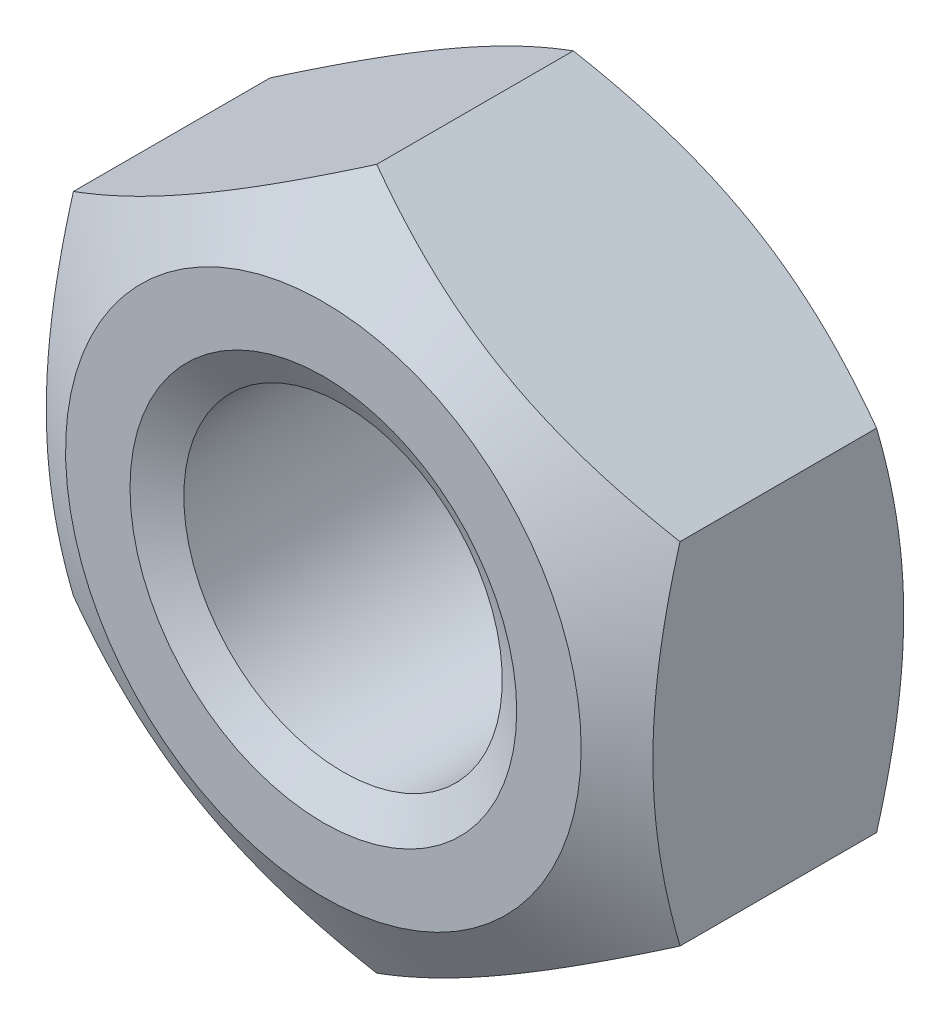
ISO-10303-21;
HEADER;
FILE_DESCRIPTION(('STEP AP214'),'2;1');
FILE_NAME('part.step','',(''),(''),'','','');
FILE_SCHEMA(('AUTOMOTIVE_DESIGN { 1 0 10303 214 1 1 1 1 }'));
ENDSEC;
DATA;
#1=APPLICATION_CONTEXT('core data for automotive mechanical design processes');
#2=APPLICATION_PROTOCOL_DEFINITION('international standard','automotive_design',2000,#1);
#3=PRODUCT_CONTEXT('',#1,'mechanical');
#4=PRODUCT('Part','Part','',(#3));
#5=PRODUCT_RELATED_PRODUCT_CATEGORY('part','',(#4));
#6=PRODUCT_DEFINITION_FORMATION('','',#4);
#7=PRODUCT_DEFINITION_CONTEXT('part definition',#1,'design');
#8=PRODUCT_DEFINITION('design','',#6,#7);
#9=PRODUCT_DEFINITION_SHAPE('','',#8);
#10=(LENGTH_UNIT() NAMED_UNIT(*) SI_UNIT(.MILLI.,.METRE.));
#11=(NAMED_UNIT(*) PLANE_ANGLE_UNIT() SI_UNIT($,.RADIAN.));
#12=(NAMED_UNIT(*) SI_UNIT($,.STERADIAN.) SOLID_ANGLE_UNIT());
#13=UNCERTAINTY_MEASURE_WITH_UNIT(LENGTH_MEASURE(1.E-05),#10,'distance_accuracy_value','');
#14=(GEOMETRIC_REPRESENTATION_CONTEXT(3) GLOBAL_UNCERTAINTY_ASSIGNED_CONTEXT((#13)) GLOBAL_UNIT_ASSIGNED_CONTEXT((#10,
#11,#12)) REPRESENTATION_CONTEXT('',''));
#15=CARTESIAN_POINT('',(0.,0.,0.));
#16=DIRECTION('',(0.,0.,1.));
#17=DIRECTION('',(1.,0.,0.));
#18=AXIS2_PLACEMENT_3D('',#15,#16,#17);
#19=CARTESIAN_POINT('',(0.,0.,0.));
#20=DIRECTION('',(0.,0.,1.));
#21=DIRECTION('',(1.,0.,0.));
#22=AXIS2_PLACEMENT_3D('',#19,#20,#21);
#23=PLANE('',#22);
#24=CARTESIAN_POINT('',(0.,0.,0.));
#25=DIRECTION('',(0.,0.,1.));
#26=DIRECTION('',(0.,-1.,0.));
#27=AXIS2_PLACEMENT_3D('',#24,#25,#26);
#28=CIRCLE('',#27,2.55);
#29=CARTESIAN_POINT('',(0.,-2.55,0.));
#30=VERTEX_POINT('',#29);
#31=EDGE_CURVE('E264',#30,#30,#28,.T.);
#32=ORIENTED_EDGE('',*,*,#31,.F.);
#33=EDGE_LOOP('',(#32));
#34=FACE_BOUND('',#33,.T.);
#35=CARTESIAN_POINT('',(0.,0.,0.));
#36=DIRECTION('',(0.,0.,1.));
#37=DIRECTION('',(1.,0.,0.));
#38=AXIS2_PLACEMENT_3D('',#35,#36,#37);
#39=CIRCLE('',#38,3.4);
#40=CARTESIAN_POINT('',(3.4,0.,0.));
#41=VERTEX_POINT('',#40);
#42=EDGE_CURVE('E223',#41,#41,#39,.T.);
#43=ORIENTED_EDGE('',*,*,#42,.T.);
#44=EDGE_LOOP('',(#43));
#45=FACE_BOUND('',#44,.T.);
#46=ADVANCED_FACE('F36',(#34,#45),#23,.T.);
#47=CARTESIAN_POINT('',(0.,0.,0.));
#48=DIRECTION('',(0.,0.,-1.));
#49=DIRECTION('',(-1.,0.,0.));
#50=AXIS2_PLACEMENT_3D('',#47,#48,#49);
#51=CONICAL_SURFACE('',#50,3.4,1.0471975511966);
#52=CARTESIAN_POINT('',(-4.0002,2.3092856067047,-0.703742420588541));
#53=CARTESIAN_POINT('',(-3.82442084967677,2.41077174646174,-0.645128035162058));
#54=CARTESIAN_POINT('',(-3.64712438367361,2.51313390883503,-0.591820482976039));
#55=CARTESIAN_POINT('',(-3.28946140682429,2.71963072479815,-0.49877183226018));
#56=CARTESIAN_POINT('',(-3.10908854102984,2.82376904741907,-0.459063650543482));
#57=CARTESIAN_POINT('',(-2.7505781812972,3.03075510011798,-0.397252376794057));
#58=CARTESIAN_POINT('',(-2.57249584706485,3.13357098372495,-0.374737893036667));
#59=CARTESIAN_POINT('',(-2.21549328283348,3.33968651028531,-0.347860784660361));
#60=CARTESIAN_POINT('',(-2.03657435035588,3.44298540411437,-0.343475902940722));
#61=CARTESIAN_POINT('',(-1.70225715780325,3.63600352522935,-0.35260023445375));
#62=CARTESIAN_POINT('',(-1.54680884001292,3.72575165335067,-0.363869115501773));
#63=CARTESIAN_POINT('',(-1.23692494436493,3.90466320392056,-0.399584152311971));
#64=CARTESIAN_POINT('',(-1.08249043825586,3.9938260075948,-0.42404250722531));
#65=CARTESIAN_POINT('',(-0.771967672225416,4.17310641015198,-0.485186226433064));
#66=CARTESIAN_POINT('',(-0.615918711936893,4.26320131938132,-0.522130765168637));
#67=CARTESIAN_POINT('',(-0.306148164596158,4.44204742827551,-0.605980234061797));
#68=CARTESIAN_POINT('',(-0.152422609226219,4.53080091904967,-0.652865463726509));
#69=CARTESIAN_POINT('',(0.000200000000000046,4.61891762357085,-0.703742420588535));
#70=B_SPLINE_CURVE_WITH_KNOTS('',3,(#52,#53,#54,#55,#56,#57,#58,#59,#60,#61,#62,#63,#64,#65,#66,
#67,#68,#69),.UNSPECIFIED.,.F.,.F.,(4,2,2,2,2,2,2,2,4),(0.,0.634047835695967,1.26961969224544,
1.88946157213122,2.50854226669298,3.04757825393386,3.58711366126903,4.13861653143762,
4.68903648037741),.UNSPECIFIED.);
#71=CARTESIAN_POINT('',(-4.,2.30940107675854,-0.703675751421939));
#72=VERTEX_POINT('',#71);
#73=CARTESIAN_POINT('',(0.,4.61880215351701,-0.703675751421931));
#74=VERTEX_POINT('',#73);
#75=EDGE_CURVE('E218',#72,#74,#70,.T.);
#76=ORIENTED_EDGE('',*,*,#75,.F.);
#77=CARTESIAN_POINT('',(-4.00000000000002,-6.07695515497812,-2.2373814474399));
#78=CARTESIAN_POINT('',(-4.00000000000002,-5.9032543263177,-2.15363732486129));
#79=CARTESIAN_POINT('',(-4.00000000000002,-5.72914085525298,-2.07073370051795));
#80=CARTESIAN_POINT('',(-4.00000000000002,-5.37986864009131,-1.90708296305103));
#81=CARTESIAN_POINT('',(-4.00000000000002,-5.20470972407353,-1.82633621728281));
#82=CARTESIAN_POINT('',(-4.00000000000002,-4.85216198559591,-1.66704105630329));
#83=CARTESIAN_POINT('',(-4.00000000000002,-4.67476611772506,-1.58850817718364));
#84=CARTESIAN_POINT('',(-4.00000000000002,-4.31851821460789,-1.43483041670244));
#85=CARTESIAN_POINT('',(-4.00000000000002,-4.13966625270327,-1.35968536593131));
#86=CARTESIAN_POINT('',(-4.00000000000002,-3.77498727863789,-1.21155595856941));
#87=CARTESIAN_POINT('',(-4.00000000000002,-3.58910865514525,-1.13869793842845));
#88=CARTESIAN_POINT('',(-4.00000000000001,-3.21513063062699,-0.998808563051088));
#89=CARTESIAN_POINT('',(-4.00000000000001,-3.02703097670914,-0.93177787874018));
#90=CARTESIAN_POINT('',(-4.00000000000001,-2.64870660136946,-0.80539597558135));
#91=CARTESIAN_POINT('',(-4.00000000000001,-2.45848751999802,-0.746028050220649));
#92=CARTESIAN_POINT('',(-4.00000000000001,-2.07532528139353,-0.636959212626413));
#93=CARTESIAN_POINT('',(-4.00000000000001,-1.88238304328725,-0.587255118544963));
#94=CARTESIAN_POINT('',(-4.00000000000001,-1.49469585021832,-0.500233591805426));
#95=CARTESIAN_POINT('',(-4.00000000000001,-1.29996491279885,-0.462854895270557));
#96=CARTESIAN_POINT('',(-4.00000000000001,-0.908220329349546,-0.402686415434137));
#97=CARTESIAN_POINT('',(-4.00000000000001,-0.711206861227053,-0.379895502801997));
#98=CARTESIAN_POINT('',(-4.,-0.31839849483112,-0.351020069763724));
#99=CARTESIAN_POINT('',(-4.,-0.122619021844374,-0.344730829827886));
#100=CARTESIAN_POINT('',(-4.,0.268775842525469,-0.348860257069983));
#101=CARTESIAN_POINT('',(-4.,0.464391227296078,-0.359279567992027));
#102=CARTESIAN_POINT('',(-4.,0.800354880614998,-0.390806759919066));
#103=CARTESIAN_POINT('',(-4.,0.941072491778448,-0.408176143924673));
#104=CARTESIAN_POINT('',(-4.,1.22138670998847,-0.450408526430881));
#105=CARTESIAN_POINT('',(-4.,1.36098314480011,-0.475272654493072));
#106=CARTESIAN_POINT('',(-4.,1.77795518732103,-0.559790316897919));
#107=CARTESIAN_POINT('',(-4.,2.0533402181718,-0.629350805422063));
#108=CARTESIAN_POINT('',(-4.,2.46499776048921,-0.748819357323082));
#109=CARTESIAN_POINT('',(-4.,2.60343041800693,-0.791698312977425));
#110=CARTESIAN_POINT('',(-3.99999999999999,2.8789496911528,-0.881620159877463));
#111=CARTESIAN_POINT('',(-3.99999999999999,3.01603629808536,-0.928663078003007));
#112=CARTESIAN_POINT('',(-3.99999999999999,3.2889129338207,-1.02618226710131));
#113=CARTESIAN_POINT('',(-3.99999999999999,3.42470343525912,-1.07665722738882));
#114=CARTESIAN_POINT('',(-3.99999999999999,3.69517894954341,-1.18047572279649));
#115=CARTESIAN_POINT('',(-3.99999999999999,3.82986397288099,-1.23381923065589));
#116=CARTESIAN_POINT('',(-3.99999999999999,4.13691488829198,-1.3586037511213));
#117=CARTESIAN_POINT('',(-3.99999999999999,4.30896022125641,-1.43083189870017));
#118=CARTESIAN_POINT('',(-3.99999999999999,4.65169566768922,-1.57844291015971));
#119=CARTESIAN_POINT('',(-3.99999999999999,4.82238571651407,-1.65382592345659));
#120=CARTESIAN_POINT('',(-3.99999999999999,5.16264905176409,-1.8071383733107));
#121=CARTESIAN_POINT('',(-3.99999999999999,5.33222215209253,-1.88506822191975));
#122=CARTESIAN_POINT('',(-3.99999999999999,5.67040669331343,-2.04299012893815));
#123=CARTESIAN_POINT('',(-3.99999999999999,5.83901811682761,-2.12298222447073));
#124=CARTESIAN_POINT('',(-3.99999999999998,6.34392630196601,-2.36561123536248));
#125=CARTESIAN_POINT('',(-3.99999999999998,6.67901057669472,-2.53077021605844));
#126=CARTESIAN_POINT('',(-3.99999999999998,7.34685912892337,-2.86571223787633));
#127=CARTESIAN_POINT('',(-3.99999999999998,7.67962333202128,-3.03549542644246));
#128=CARTESIAN_POINT('',(-3.99999999999998,8.317498765285,-3.36498995737981));
#129=CARTESIAN_POINT('',(-3.99999999999998,8.62273913527458,-3.52445174156826));
#130=CARTESIAN_POINT('',(-3.99999999999998,9.23210196710995,-3.8455148283192));
#131=CARTESIAN_POINT('',(-3.99999999999998,9.53622439670164,-4.00711619200202));
#132=CARTESIAN_POINT('',(-3.99999999999997,10.1429400100281,-4.33161439240571));
#133=CARTESIAN_POINT('',(-3.99999999999997,10.445535073287,-4.49450771938575));
#134=CARTESIAN_POINT('',(-3.99999999999997,11.0500044860671,-4.82159262428182));
#135=CARTESIAN_POINT('',(-3.99999999999997,11.3518788690681,-4.98578414029912));
#136=CARTESIAN_POINT('',(-3.99999999999997,11.6534848899343,-5.15046370914897));
#137=B_SPLINE_CURVE_WITH_KNOTS('',3,(#77,#78,#79,#80,#81,#82,#83,#84,#85,#86,#87,#88,#89,#90,
#91,#92,#93,#94,#95,#96,#97,#98,#99,#100,#101,#102,#103,#104,#105,#106,#107,#108,#109,#110,#111,
#112,#113,#114,#115,#116,#117,#118,#119,#120,#121,#122,#123,#124,#125,#126,#127,#128,#129,#130,
#131,#132,#133,#134,#135,#136),.UNSPECIFIED.,.F.,.F.,(4,2,2,2,2,2,2,2,2,2,2,2,2,2,2,2,2,2,2,2,2,
2,2,2,2,2,2,2,2,4),(0.,0.578510532643124,1.15711897581723,1.73909615938132,2.32104420861426,
2.91991150400879,3.51884765843071,4.11645511141911,4.71386546575289,5.30825996269123,
5.90260843830731,6.4895477887196,7.07650975317129,7.50165768714806,7.92686972886383,
8.77781431814756,9.2125455279647,9.64727954433008,10.0818484597445,10.516413246036,
11.0761472269744,11.6359077472955,12.195759283887,12.7556209056077,13.876288345485,
14.9969915600945,16.0301298384023,17.0632976938262,18.094255943369,19.1251653288944),.UNSPECIFIED.);
#138=CARTESIAN_POINT('',(-4.00000000000001,-2.30940107675852,-0.703675751421939));
#139=VERTEX_POINT('',#138);
#140=EDGE_CURVE('E186',#139,#72,#137,.T.);
#141=ORIENTED_EDGE('',*,*,#140,.F.);
#142=CARTESIAN_POINT('',(0.000199999999979301,-4.61891762357085,-0.703742420588535));
#143=CARTESIAN_POINT('',(-0.175579150323248,-4.51743148381381,-0.645128035162051));
#144=CARTESIAN_POINT('',(-0.352875616326401,-4.41506932144052,-0.591820482976032));
#145=CARTESIAN_POINT('',(-0.710538593175726,-4.2085725054774,-0.498771832260174));
#146=CARTESIAN_POINT('',(-0.890911458970169,-4.10443418285647,-0.459063650543475));
#147=CARTESIAN_POINT('',(-1.24942181870281,-3.89744813015756,-0.39725237679405));
#148=CARTESIAN_POINT('',(-1.42750415293516,-3.79463224655059,-0.374737893036661));
#149=CARTESIAN_POINT('',(-1.78450671716652,-3.58851671999022,-0.347860784660354));
#150=CARTESIAN_POINT('',(-1.96342564964412,-3.48521782616117,-0.343475902940715));
#151=CARTESIAN_POINT('',(-2.29774284219675,-3.29219970504618,-0.352600234453742));
#152=CARTESIAN_POINT('',(-2.45319115998708,-3.20245157692486,-0.363869115501766));
#153=CARTESIAN_POINT('',(-2.76307505563507,-3.02354002635496,-0.399584152311964));
#154=CARTESIAN_POINT('',(-2.91750956174414,-2.93437722268072,-0.424042507225304));
#155=CARTESIAN_POINT('',(-3.22803232777459,-2.75509682012353,-0.485186226433059));
#156=CARTESIAN_POINT('',(-3.38408128806311,-2.66500191089419,-0.522130765168633));
#157=CARTESIAN_POINT('',(-3.69385183540385,-2.486155802,-0.605980234061795));
#158=CARTESIAN_POINT('',(-3.84757739077379,-2.39740231122584,-0.652865463726508));
#159=CARTESIAN_POINT('',(-4.00020000000001,-2.30928560670465,-0.703742420588534));
#160=B_SPLINE_CURVE_WITH_KNOTS('',3,(#142,#143,#144,#145,#146,#147,#148,#149,#150,#151,#152,
#153,#154,#155,#156,#157,#158,#159),.UNSPECIFIED.,.F.,.F.,(4,2,2,2,2,2,2,2,4),(0.,
0.634047835695966,1.26961969224543,1.88946157213122,2.50854226669297,3.04757825393385,
3.58711366126903,4.13861653143764,4.68903648037743),.UNSPECIFIED.);
#161=CARTESIAN_POINT('',(0.,-4.61880215351702,-0.703675751421939));
#162=VERTEX_POINT('',#161);
#163=EDGE_CURVE('E178',#162,#139,#160,.T.);
#164=ORIENTED_EDGE('',*,*,#163,.F.);
#165=CARTESIAN_POINT('',(4.00019999999998,-2.30928560670469,-0.70374242058853));
#166=CARTESIAN_POINT('',(3.82442084967675,-2.41077174646173,-0.645128035162047));
#167=CARTESIAN_POINT('',(3.6471243836736,-2.51313390883502,-0.591820482976028));
#168=CARTESIAN_POINT('',(3.28946140682428,-2.71963072479813,-0.498771832260171));
#169=CARTESIAN_POINT('',(3.10908854102983,-2.82376904741906,-0.459063650543472));
#170=CARTESIAN_POINT('',(2.75057818129719,-3.03075510011797,-0.397252376794048));
#171=CARTESIAN_POINT('',(2.57249584706484,-3.13357098372493,-0.374737893036658));
#172=CARTESIAN_POINT('',(2.21549328283347,-3.3396865102853,-0.347860784660352));
#173=CARTESIAN_POINT('',(2.03657435035588,-3.44298540411435,-0.343475902940714));
#174=CARTESIAN_POINT('',(1.70225715780325,-3.63600352522933,-0.352600234453741));
#175=CARTESIAN_POINT('',(1.54680884001291,-3.72575165335066,-0.363869115501765));
#176=CARTESIAN_POINT('',(1.23692494436492,-3.90466320392055,-0.399584152311964));
#177=CARTESIAN_POINT('',(1.08249043825585,-3.99382600759479,-0.424042507225304));
#178=CARTESIAN_POINT('',(0.771967672225402,-4.17310641015198,-0.485186226433059));
#179=CARTESIAN_POINT('',(0.615918711936877,-4.26320131938132,-0.522130765168633));
#180=CARTESIAN_POINT('',(0.30614816459614,-4.44204742827551,-0.605980234061796));
#181=CARTESIAN_POINT('',(0.1524226092262,-4.53080091904967,-0.652865463726509));
#182=CARTESIAN_POINT('',(-0.000200000000020717,-4.61891762357085,-0.703742420588535));
#183=B_SPLINE_CURVE_WITH_KNOTS('',3,(#165,#166,#167,#168,#169,#170,#171,#172,#173,#174,#175,
#176,#177,#178,#179,#180,#181,#182),.UNSPECIFIED.,.F.,.F.,(4,2,2,2,2,2,2,2,4),(0.,
0.634047835695965,1.26961969224543,1.88946157213122,2.50854226669297,3.04757825393385,
3.58711366126903,4.13861653143763,4.68903648037742),.UNSPECIFIED.);
#184=CARTESIAN_POINT('',(4.00000000000002,-2.3094010767585,-0.703675751421939));
#185=VERTEX_POINT('',#184);
#186=EDGE_CURVE('E94',#185,#162,#183,.T.);
#187=ORIENTED_EDGE('',*,*,#186,.F.);
#188=CARTESIAN_POINT('',(3.99999999999997,-6.0769551549324,-2.23738144741783));
#189=CARTESIAN_POINT('',(3.99999999999997,-5.90325432627351,-2.15363732484015));
#190=CARTESIAN_POINT('',(3.99999999999997,-5.72914085521033,-2.07073370049774));
#191=CARTESIAN_POINT('',(3.99999999999997,-5.37986864005173,-1.90708296303267));
#192=CARTESIAN_POINT('',(3.99999999999998,-5.20470972403549,-1.82633621726538));
#193=CARTESIAN_POINT('',(3.99999999999998,-4.85216198556098,-1.66704105628771));
#194=CARTESIAN_POINT('',(3.99999999999998,-4.6747661176917,-1.58850817716899));
#195=CARTESIAN_POINT('',(3.99999999999998,-4.31851821457767,-1.43483041668963));
#196=CARTESIAN_POINT('',(3.99999999999998,-4.13966625267463,-1.35968536591941));
#197=CARTESIAN_POINT('',(3.99999999999998,-3.7749872786125,-1.21155595855934));
#198=CARTESIAN_POINT('',(3.99999999999998,-3.58910865512155,-1.1386979384193));
#199=CARTESIAN_POINT('',(3.99999999999998,-3.21513063060667,-0.998808563043735));
#200=CARTESIAN_POINT('',(3.99999999999998,-3.02703097669053,-0.931777878733698));
#201=CARTESIAN_POINT('',(3.99999999999998,-2.6487066013543,-0.80539597557652));
#202=CARTESIAN_POINT('',(3.99999999999998,-2.4584875199846,-0.746028050216601));
#203=CARTESIAN_POINT('',(3.99999999999998,-2.07532528138363,-0.636959212623796));
#204=CARTESIAN_POINT('',(3.99999999999998,-1.88238304327914,-0.587255118542993));
#205=CARTESIAN_POINT('',(3.99999999999999,-1.49469585021477,-0.500233591804753));
#206=CARTESIAN_POINT('',(3.99999999999999,-1.29996491279806,-0.462854895270476));
#207=CARTESIAN_POINT('',(3.99999999999999,-0.908220329354366,-0.402686415434816));
#208=CARTESIAN_POINT('',(3.99999999999999,-0.711206861234705,-0.379895502802841));
#209=CARTESIAN_POINT('',(3.99999999999999,-0.318398494844387,-0.351020069764402));
#210=CARTESIAN_POINT('',(3.99999999999999,-0.122619021860423,-0.344730829828239));
#211=CARTESIAN_POINT('',(3.99999999999999,0.268775842503905,-0.348860257069217));
#212=CARTESIAN_POINT('',(3.99999999999999,0.464391227271782,-0.359279567990468));
#213=CARTESIAN_POINT('',(3.99999999999999,0.800354880587181,-0.390806759915922));
#214=CARTESIAN_POINT('',(3.99999999999999,0.941072491749812,-0.40817614392089));
#215=CARTESIAN_POINT('',(3.99999999999999,1.22138670995823,-0.450408526425786));
#216=CARTESIAN_POINT('',(3.99999999999999,1.36098314476908,-0.475272654487303));
#217=CARTESIAN_POINT('',(3.99999999999999,1.77795518728769,-0.559790316890113));
#218=CARTESIAN_POINT('',(4.,2.05334021813697,-0.629350805412878));
#219=CARTESIAN_POINT('',(4.,2.46499776045215,-0.748819357311856));
#220=CARTESIAN_POINT('',(4.,2.60343041796912,-0.791698312965514));
#221=CARTESIAN_POINT('',(4.,2.87894969111348,-0.8816201598642));
#222=CARTESIAN_POINT('',(4.,3.01603629804529,-0.928663077989078));
#223=CARTESIAN_POINT('',(4.,3.28891293377914,-1.02618226708607));
#224=CARTESIAN_POINT('',(4.,3.42470343521681,-1.07665722737293));
#225=CARTESIAN_POINT('',(4.,3.69517894949961,-1.18047572277933));
#226=CARTESIAN_POINT('',(4.,3.82986397283645,-1.2338192306381));
#227=CARTESIAN_POINT('',(4.,4.13691488824689,-1.35860375110258));
#228=CARTESIAN_POINT('',(4.,4.30896022121151,-1.43083189868117));
#229=CARTESIAN_POINT('',(4.,4.65169566764468,-1.5784429101402));
#230=CARTESIAN_POINT('',(4.,4.82238571646969,-1.65382592343687));
#231=CARTESIAN_POINT('',(4.,5.16264905172003,-1.80713837329059));
#232=CARTESIAN_POINT('',(4.00000000000001,5.33222215204862,-1.88506822189947));
#233=CARTESIAN_POINT('',(4.00000000000001,5.67040669326981,-2.04299012891757));
#234=CARTESIAN_POINT('',(4.00000000000001,5.83901811678412,-2.12298222445002));
#235=CARTESIAN_POINT('',(4.00000000000001,6.34392630192293,-2.36561123534142));
#236=CARTESIAN_POINT('',(4.00000000000001,6.67901057665187,-2.53077021603721));
#237=CARTESIAN_POINT('',(4.00000000000001,7.34685912888098,-2.86571223785483));
#238=CARTESIAN_POINT('',(4.00000000000001,7.6796233319791,-3.03549542642086));
#239=CARTESIAN_POINT('',(4.00000000000002,8.31749876524306,-3.36498995735798));
#240=CARTESIAN_POINT('',(4.00000000000002,8.62273913523266,-3.52445174154631));
#241=CARTESIAN_POINT('',(4.00000000000002,9.23210196706807,-3.84551482829702));
#242=CARTESIAN_POINT('',(4.00000000000002,9.53622439665977,-4.00711619197974));
#243=CARTESIAN_POINT('',(4.00000000000002,10.1429400099863,-4.33161439238322));
#244=CARTESIAN_POINT('',(4.00000000000002,10.4455350732451,-4.49450771936317));
#245=CARTESIAN_POINT('',(4.00000000000002,11.0500044860252,-4.82159262425907));
#246=CARTESIAN_POINT('',(4.00000000000002,11.3518788690262,-4.98578414027629));
#247=CARTESIAN_POINT('',(4.00000000000002,11.6534848898923,-5.15046370912605));
#248=B_SPLINE_CURVE_WITH_KNOTS('',3,(#188,#189,#190,#191,#192,#193,#194,#195,#196,#197,#198,
#199,#200,#201,#202,#203,#204,#205,#206,#207,#208,#209,#210,#211,#212,#213,#214,#215,#216,#217,
#218,#219,#220,#221,#222,#223,#224,#225,#226,#227,#228,#229,#230,#231,#232,#233,#234,#235,#236,
#237,#238,#239,#240,#241,#242,#243,#244,#245,#246,#247),.UNSPECIFIED.,.F.,.F.,(4,2,2,2,2,2,2,2,
2,2,2,2,2,2,2,2,2,2,2,2,2,2,2,2,2,2,2,2,2,4),(0.,0.578510532637764,1.15711897580652,
1.73909615936518,2.3210442085927,2.91991150398152,3.51884765839774,4.11645511138047,
4.71386546570857,5.30825996263843,5.90260843824604,6.48954778865005,7.07650975309345,
7.50165768706756,7.92686972878065,8.77781431805904,9.21254552787339,9.64727954423599,
10.0818484596477,10.5164132459364,11.076147226875,11.6359077471963,12.195759283788,
12.7556209055089,13.8762883453866,14.9969915599965,16.0301298383042,17.063297693728,
18.0942559432706,19.1251653287958),.UNSPECIFIED.);
#249=CARTESIAN_POINT('',(4.,2.30940107675854,-0.703675751421939));
#250=VERTEX_POINT('',#249);
#251=EDGE_CURVE('E90',#250,#185,#248,.F.);
#252=ORIENTED_EDGE('',*,*,#251,.F.);
#253=CARTESIAN_POINT('',(-0.000200000000000122,4.61891762357085,-0.703742420588534));
#254=CARTESIAN_POINT('',(0.175579150323227,4.51743148381381,-0.645128035162051));
#255=CARTESIAN_POINT('',(0.352875616326379,4.41506932144052,-0.591820482976031));
#256=CARTESIAN_POINT('',(0.710538593175704,4.2085725054774,-0.498771832260173));
#257=CARTESIAN_POINT('',(0.890911458970149,4.10443418285647,-0.459063650543474));
#258=CARTESIAN_POINT('',(1.24942181870279,3.89744813015756,-0.397252376794049));
#259=CARTESIAN_POINT('',(1.42750415293514,3.79463224655059,-0.374737893036658));
#260=CARTESIAN_POINT('',(1.78450671716651,3.58851671999023,-0.347860784660351));
#261=CARTESIAN_POINT('',(1.9634256496441,3.48521782616117,-0.343475902940713));
#262=CARTESIAN_POINT('',(2.29774284219673,3.29219970504619,-0.352600234453739));
#263=CARTESIAN_POINT('',(2.45319115998706,3.20245157692486,-0.363869115501762));
#264=CARTESIAN_POINT('',(2.76307505563505,3.02354002635496,-0.39958415231196));
#265=CARTESIAN_POINT('',(2.91750956174413,2.93437722268072,-0.424042507225299));
#266=CARTESIAN_POINT('',(3.22803232777457,2.75509682012354,-0.485186226433055));
#267=CARTESIAN_POINT('',(3.3840812880631,2.6650019108942,-0.522130765168628));
#268=CARTESIAN_POINT('',(3.69385183540384,2.486155802,-0.60598023406179));
#269=CARTESIAN_POINT('',(3.84757739077378,2.39740231122584,-0.652865463726503));
#270=CARTESIAN_POINT('',(4.0002,2.30928560670466,-0.703742420588529));
#271=B_SPLINE_CURVE_WITH_KNOTS('',3,(#253,#254,#255,#256,#257,#258,#259,#260,#261,#262,#263,
#264,#265,#266,#267,#268,#269,#270),.UNSPECIFIED.,.F.,.F.,(4,2,2,2,2,2,2,2,4),(0.,
0.634047835695965,1.26961969224543,1.88946157213122,2.50854226669297,3.04757825393386,
3.58711366126903,4.13861653143764,4.68903648037743),.UNSPECIFIED.);
#272=EDGE_CURVE('E62',#74,#250,#271,.T.);
#273=ORIENTED_EDGE('',*,*,#272,.F.);
#274=EDGE_LOOP('',(#76,#141,#164,#187,#252,#273));
#275=FACE_BOUND('',#274,.T.);
#276=ORIENTED_EDGE('',*,*,#42,.F.);
#277=EDGE_LOOP('',(#276));
#278=FACE_BOUND('',#277,.T.);
#279=ADVANCED_FACE('F91',(#275,#278),#51,.T.);
#280=CARTESIAN_POINT('',(4.,2.3094010767585,-4.));
#281=DIRECTION('',(0.500000000000002,0.866025403784438,0.));
#282=DIRECTION('',(-0.866025403784438,0.500000000000002,0.));
#283=AXIS2_PLACEMENT_3D('',#280,#281,#282);
#284=PLANE('',#283);
#285=DIRECTION('',(0.,0.,1.));
#286=VECTOR('',#285,1.);
#287=CARTESIAN_POINT('',(4.,2.3094010767585,-4.));
#288=LINE('',#287,#286);
#289=CARTESIAN_POINT('',(4.,2.30940107675852,-3.29632424857807));
#290=VERTEX_POINT('',#289);
#291=EDGE_CURVE('E11',#290,#250,#288,.T.);
#292=ORIENTED_EDGE('',*,*,#291,.F.);
#293=CARTESIAN_POINT('',(4.0002,2.30928560670466,-3.29625757941147));
#294=CARTESIAN_POINT('',(3.82442084967677,2.4107717464617,-3.35487196483796));
#295=CARTESIAN_POINT('',(3.64712438367362,2.51313390883499,-3.40817951702398));
#296=CARTESIAN_POINT('',(3.28946140682429,2.71963072479811,-3.50122816773983));
#297=CARTESIAN_POINT('',(3.10908854102985,2.82376904741904,-3.54093634945653));
#298=CARTESIAN_POINT('',(2.75057818129721,3.03075510011795,-3.60274762320596));
#299=CARTESIAN_POINT('',(2.57249584706486,3.13357098372491,-3.62526210696335));
#300=CARTESIAN_POINT('',(2.21549328283349,3.33968651028528,-3.65213921533965));
#301=CARTESIAN_POINT('',(2.0365743503559,3.44298540411434,-3.65652409705929));
#302=CARTESIAN_POINT('',(1.70225715780327,3.63600352522932,-3.64739976554626));
#303=CARTESIAN_POINT('',(1.54680884001294,3.72575165335064,-3.63613088449824));
#304=CARTESIAN_POINT('',(1.23692494436495,3.90466320392054,-3.60041584768804));
#305=CARTESIAN_POINT('',(1.08249043825587,3.99382600759478,-3.5759574927747));
#306=CARTESIAN_POINT('',(0.771967672225423,4.17310641015197,-3.51481377356694));
#307=CARTESIAN_POINT('',(0.615918711936899,4.26320131938131,-3.47786923483137));
#308=CARTESIAN_POINT('',(0.306148164596161,4.44204742827551,-3.39401976593821));
#309=CARTESIAN_POINT('',(0.152422609226221,4.53080091904967,-3.34713453627349));
#310=CARTESIAN_POINT('',(-0.000199999999999848,4.61891762357085,-3.29625757941147));
#311=B_SPLINE_CURVE_WITH_KNOTS('',3,(#293,#294,#295,#296,#297,#298,#299,#300,#301,#302,#303,
#304,#305,#306,#307,#308,#309,#310),.UNSPECIFIED.,.F.,.F.,(4,2,2,2,2,2,2,2,4),(0.,
0.634047835695965,1.26961969224543,1.88946157213122,2.50854226669296,3.04757825393385,
3.58711366126903,4.13861653143764,4.68903648037743),.UNSPECIFIED.);
#312=CARTESIAN_POINT('',(0.,4.61880215351701,-3.29632424857807));
#313=VERTEX_POINT('',#312);
#314=EDGE_CURVE('E110',#290,#313,#311,.T.);
#315=ORIENTED_EDGE('',*,*,#314,.T.);
#316=DIRECTION('',(0.,0.,1.));
#317=VECTOR('',#316,1.);
#318=CARTESIAN_POINT('',(0.,4.61880215351701,-4.));
#319=LINE('',#318,#317);
#320=EDGE_CURVE('E41',#313,#74,#319,.T.);
#321=ORIENTED_EDGE('',*,*,#320,.T.);
#322=ORIENTED_EDGE('',*,*,#272,.T.);
#323=EDGE_LOOP('',(#292,#315,#321,#322));
#324=FACE_BOUND('',#323,.T.);
#325=ADVANCED_FACE('F38',(#324),#284,.T.);
#326=CARTESIAN_POINT('',(3.99999999999998,-2.30940107675853,-4.));
#327=DIRECTION('',(1.,0.,0.));
#328=DIRECTION('',(0.,1.,0.));
#329=AXIS2_PLACEMENT_3D('',#326,#327,#328);
#330=PLANE('',#329);
#331=DIRECTION('',(0.,0.,1.));
#332=VECTOR('',#331,1.);
#333=CARTESIAN_POINT('',(3.99999999999998,-2.30940107675853,-4.));
#334=LINE('',#333,#332);
#335=CARTESIAN_POINT('',(3.99999999999999,-2.30940107675852,-3.29632424857807));
#336=VERTEX_POINT('',#335);
#337=EDGE_CURVE('E46',#336,#185,#334,.T.);
#338=ORIENTED_EDGE('',*,*,#337,.F.);
#339=CARTESIAN_POINT('',(3.99999999999997,-6.07695515493239,-1.76261855258217));
#340=CARTESIAN_POINT('',(3.99999999999997,-5.90325432627351,-1.84636267515985));
#341=CARTESIAN_POINT('',(3.99999999999997,-5.72914085521032,-1.92926629950225));
#342=CARTESIAN_POINT('',(3.99999999999997,-5.37986864005173,-2.09291703696732));
#343=CARTESIAN_POINT('',(3.99999999999998,-5.20470972403549,-2.17366378273462));
#344=CARTESIAN_POINT('',(3.99999999999998,-4.85216198556098,-2.33295894371229));
#345=CARTESIAN_POINT('',(3.99999999999998,-4.6747661176917,-2.41149182283101));
#346=CARTESIAN_POINT('',(3.99999999999998,-4.31851821457767,-2.56516958331037));
#347=CARTESIAN_POINT('',(3.99999999999998,-4.13966625267463,-2.64031463408059));
#348=CARTESIAN_POINT('',(3.99999999999998,-3.7749872786125,-2.78844404144066));
#349=CARTESIAN_POINT('',(3.99999999999998,-3.58910865512154,-2.8613020615807));
#350=CARTESIAN_POINT('',(3.99999999999998,-3.21513063060667,-3.00119143695627));
#351=CARTESIAN_POINT('',(3.99999999999998,-3.02703097669053,-3.0682221212663));
#352=CARTESIAN_POINT('',(3.99999999999998,-2.6487066013543,-3.19460402442348));
#353=CARTESIAN_POINT('',(3.99999999999998,-2.4584875199846,-3.2539719497834));
#354=CARTESIAN_POINT('',(3.99999999999998,-2.07532528138363,-3.36304078737621));
#355=CARTESIAN_POINT('',(3.99999999999998,-1.88238304327914,-3.41274488145701));
#356=CARTESIAN_POINT('',(3.99999999999999,-1.49469585021476,-3.49976640819525));
#357=CARTESIAN_POINT('',(3.99999999999999,-1.29996491279806,-3.53714510472953));
#358=CARTESIAN_POINT('',(3.99999999999999,-0.908220329354364,-3.59731358456519));
#359=CARTESIAN_POINT('',(3.99999999999999,-0.711206861234704,-3.62010449719716));
#360=CARTESIAN_POINT('',(3.99999999999999,-0.318398494844385,-3.6489799302356));
#361=CARTESIAN_POINT('',(3.99999999999999,-0.122619021860421,-3.65526917017176));
#362=CARTESIAN_POINT('',(3.99999999999999,0.268775842503906,-3.65113974293079));
#363=CARTESIAN_POINT('',(3.99999999999999,0.464391227271783,-3.64072043200953));
#364=CARTESIAN_POINT('',(3.99999999999999,0.800354880587182,-3.60919324008408));
#365=CARTESIAN_POINT('',(3.99999999999999,0.941072491749812,-3.59182385607911));
#366=CARTESIAN_POINT('',(3.99999999999999,1.22138670995823,-3.54959147357422));
#367=CARTESIAN_POINT('',(3.99999999999999,1.36098314476908,-3.5247273455127));
#368=CARTESIAN_POINT('',(3.99999999999999,1.77795518728769,-3.44020968310989));
#369=CARTESIAN_POINT('',(4.,2.05334021813697,-3.37064919458713));
#370=CARTESIAN_POINT('',(4.,2.46499776045215,-3.25118064268815));
#371=CARTESIAN_POINT('',(4.,2.60343041796911,-3.20830168703449));
#372=CARTESIAN_POINT('',(4.,2.87894969111347,-3.1183798401358));
#373=CARTESIAN_POINT('',(4.,3.01603629804529,-3.07133692201093));
#374=CARTESIAN_POINT('',(4.,3.28891293377913,-2.97381773291393));
#375=CARTESIAN_POINT('',(4.,3.4247034352168,-2.92334277262707));
#376=CARTESIAN_POINT('',(4.,3.6951789494996,-2.81952427722068));
#377=CARTESIAN_POINT('',(4.,3.82986397283644,-2.7661807693619));
#378=CARTESIAN_POINT('',(4.,4.13691488824688,-2.64139624889742));
#379=CARTESIAN_POINT('',(4.,4.3089602212115,-2.56916810131884));
#380=CARTESIAN_POINT('',(4.,4.65169566764467,-2.4215570898598));
#381=CARTESIAN_POINT('',(4.,4.82238571646968,-2.34617407656314));
#382=CARTESIAN_POINT('',(4.,5.16264905172002,-2.19286162670942));
#383=CARTESIAN_POINT('',(4.00000000000001,5.3322221520486,-2.11493177810053));
#384=CARTESIAN_POINT('',(4.00000000000001,5.6704066932698,-1.95700987108243));
#385=CARTESIAN_POINT('',(4.00000000000001,5.83901811678411,-1.87701777554998));
#386=CARTESIAN_POINT('',(4.00000000000001,6.34392630192291,-1.63438876465858));
#387=CARTESIAN_POINT('',(4.00000000000001,6.67901057665186,-1.46922978396279));
#388=CARTESIAN_POINT('',(4.00000000000001,7.34685912888097,-1.13428776214517));
#389=CARTESIAN_POINT('',(4.00000000000001,7.67962333197908,-0.964504573579142));
#390=CARTESIAN_POINT('',(4.00000000000002,8.31749876524304,-0.635010042642018));
#391=CARTESIAN_POINT('',(4.00000000000002,8.62273913523264,-0.475548258453689));
#392=CARTESIAN_POINT('',(4.00000000000002,9.23210196706805,-0.154485171702978));
#393=CARTESIAN_POINT('',(4.00000000000002,9.53622439665975,0.00711619197974118));
#394=CARTESIAN_POINT('',(4.00000000000002,10.1429400099863,0.331614392383225));
#395=CARTESIAN_POINT('',(4.00000000000002,10.445535073245,0.494507719363168));
#396=CARTESIAN_POINT('',(4.00000000000002,11.0500044860251,0.821592624259068));
#397=CARTESIAN_POINT('',(4.00000000000002,11.3518788690261,0.985784140276285));
#398=CARTESIAN_POINT('',(4.00000000000002,11.6534848898923,1.15046370912605));
#399=B_SPLINE_CURVE_WITH_KNOTS('',3,(#339,#340,#341,#342,#343,#344,#345,#346,#347,#348,#349,
#350,#351,#352,#353,#354,#355,#356,#357,#358,#359,#360,#361,#362,#363,#364,#365,#366,#367,#368,
#369,#370,#371,#372,#373,#374,#375,#376,#377,#378,#379,#380,#381,#382,#383,#384,#385,#386,#387,
#388,#389,#390,#391,#392,#393,#394,#395,#396,#397,#398),.UNSPECIFIED.,.F.,.F.,(4,2,2,2,2,2,2,2,
2,2,2,2,2,2,2,2,2,2,2,2,2,2,2,2,2,2,2,2,2,4),(0.,0.578510532637765,1.15711897580652,
1.73909615936518,2.3210442085927,2.91991150398152,3.51884765839774,4.11645511138047,
4.71386546570857,5.30825996263843,5.90260843824604,6.48954778865005,7.07650975309345,
7.50165768706756,7.92686972878065,8.77781431805903,9.21254552787339,9.64727954423599,
10.0818484596477,10.5164132459364,11.076147226875,11.6359077471963,12.195759283788,
12.7556209055089,13.8762883453866,14.9969915599965,16.0301298383042,17.063297693728,
18.0942559432706,19.1251653287958),.UNSPECIFIED.);
#400=EDGE_CURVE('E108',#336,#290,#399,.T.);
#401=ORIENTED_EDGE('',*,*,#400,.T.);
#402=ORIENTED_EDGE('',*,*,#291,.T.);
#403=ORIENTED_EDGE('',*,*,#251,.T.);
#404=EDGE_LOOP('',(#338,#401,#402,#403));
#405=FACE_BOUND('',#404,.T.);
#406=ADVANCED_FACE('F107',(#405),#330,.T.);
#407=CARTESIAN_POINT('',(0.,-4.61880215351701,-4.));
#408=DIRECTION('',(0.499999999999997,-0.866025403784441,0.));
#409=DIRECTION('',(0.866025403784441,0.499999999999997,0.));
#410=AXIS2_PLACEMENT_3D('',#407,#408,#409);
#411=PLANE('',#410);
#412=DIRECTION('',(0.,0.,1.));
#413=VECTOR('',#412,1.);
#414=CARTESIAN_POINT('',(0.,-4.61880215351701,-4.));
#415=LINE('',#414,#413);
#416=CARTESIAN_POINT('',(0.,-4.61880215351701,-3.29632424857807));
#417=VERTEX_POINT('',#416);
#418=EDGE_CURVE('E207',#417,#162,#415,.T.);
#419=ORIENTED_EDGE('',*,*,#418,.F.);
#420=CARTESIAN_POINT('',(-0.00020000000002079,-4.61891762357085,-3.29625757941147));
#421=CARTESIAN_POINT('',(0.175579150323208,-4.51743148381381,-3.35487196483795));
#422=CARTESIAN_POINT('',(0.352875616326361,-4.41506932144052,-3.40817951702397));
#423=CARTESIAN_POINT('',(0.710538593175687,-4.2085725054774,-3.50122816773983));
#424=CARTESIAN_POINT('',(0.890911458970132,-4.10443418285647,-3.54093634945653));
#425=CARTESIAN_POINT('',(1.24942181870277,-3.89744813015757,-3.60274762320595));
#426=CARTESIAN_POINT('',(1.42750415293512,-3.7946322465506,-3.62526210696334));
#427=CARTESIAN_POINT('',(1.78450671716649,-3.58851671999024,-3.65213921533965));
#428=CARTESIAN_POINT('',(1.96342564964408,-3.48521782616118,-3.65652409705929));
#429=CARTESIAN_POINT('',(2.29774284219672,-3.2921997050462,-3.64739976554626));
#430=CARTESIAN_POINT('',(2.45319115998705,-3.20245157692488,-3.63613088449824));
#431=CARTESIAN_POINT('',(2.76307505563504,-3.02354002635498,-3.60041584768804));
#432=CARTESIAN_POINT('',(2.91750956174411,-2.93437722268074,-3.5759574927747));
#433=CARTESIAN_POINT('',(3.22803232777456,-2.75509682012356,-3.51481377356695));
#434=CARTESIAN_POINT('',(3.38408128806308,-2.66500191089422,-3.47786923483137));
#435=CARTESIAN_POINT('',(3.69385183540382,-2.48615580200003,-3.39401976593821));
#436=CARTESIAN_POINT('',(3.84757739077376,-2.39740231122587,-3.3471345362735));
#437=CARTESIAN_POINT('',(4.00019999999998,-2.30928560670469,-3.29625757941147));
#438=B_SPLINE_CURVE_WITH_KNOTS('',3,(#420,#421,#422,#423,#424,#425,#426,#427,#428,#429,#430,
#431,#432,#433,#434,#435,#436,#437),.UNSPECIFIED.,.F.,.F.,(4,2,2,2,2,2,2,2,4),(0.,
0.634047835695966,1.26961969224543,1.88946157213122,2.50854226669297,3.04757825393385,
3.58711366126903,4.13861653143763,4.68903648037742),.UNSPECIFIED.);
#439=EDGE_CURVE('E111',#417,#336,#438,.T.);
#440=ORIENTED_EDGE('',*,*,#439,.T.);
#441=ORIENTED_EDGE('',*,*,#337,.T.);
#442=ORIENTED_EDGE('',*,*,#186,.T.);
#443=EDGE_LOOP('',(#419,#440,#441,#442));
#444=FACE_BOUND('',#443,.T.);
#445=ADVANCED_FACE('F172',(#444),#411,.T.);
#446=CARTESIAN_POINT('',(-4.00000000000001,-2.30940107675849,-4.));
#447=DIRECTION('',(-0.500000000000004,-0.866025403784437,0.));
#448=DIRECTION('',(0.866025403784437,-0.500000000000004,0.));
#449=AXIS2_PLACEMENT_3D('',#446,#447,#448);
#450=PLANE('',#449);
#451=DIRECTION('',(0.,0.,1.));
#452=VECTOR('',#451,1.);
#453=CARTESIAN_POINT('',(-4.00000000000001,-2.30940107675849,-4.));
#454=LINE('',#453,#452);
#455=CARTESIAN_POINT('',(-4.00000000000001,-2.30940107675849,-3.29632424857807));
#456=VERTEX_POINT('',#455);
#457=EDGE_CURVE('E210',#456,#139,#454,.T.);
#458=ORIENTED_EDGE('',*,*,#457,.F.);
#459=CARTESIAN_POINT('',(-4.00020000000001,-2.30928560670465,-3.29625757941147));
#460=CARTESIAN_POINT('',(-3.82442084967678,-2.41077174646169,-3.35487196483795));
#461=CARTESIAN_POINT('',(-3.64712438367363,-2.51313390883498,-3.40817951702397));
#462=CARTESIAN_POINT('',(-3.28946140682431,-2.71963072479811,-3.50122816773983));
#463=CARTESIAN_POINT('',(-3.10908854102986,-2.82376904741903,-3.54093634945653));
#464=CARTESIAN_POINT('',(-2.75057818129722,-3.03075510011794,-3.60274762320595));
#465=CARTESIAN_POINT('',(-2.57249584706487,-3.13357098372491,-3.62526210696334));
#466=CARTESIAN_POINT('',(-2.21549328283351,-3.33968651028528,-3.65213921533965));
#467=CARTESIAN_POINT('',(-2.03657435035591,-3.44298540411434,-3.65652409705929));
#468=CARTESIAN_POINT('',(-1.70225715780328,-3.63600352522932,-3.64739976554626));
#469=CARTESIAN_POINT('',(-1.54680884001295,-3.72575165335064,-3.63613088449824));
#470=CARTESIAN_POINT('',(-1.23692494436496,-3.90466320392054,-3.60041584768804));
#471=CARTESIAN_POINT('',(-1.08249043825589,-3.99382600759478,-3.5759574927747));
#472=CARTESIAN_POINT('',(-0.77196767222544,-4.17310641015197,-3.51481377356694));
#473=CARTESIAN_POINT('',(-0.615918711936916,-4.26320131938131,-3.47786923483137));
#474=CARTESIAN_POINT('',(-0.30614816459618,-4.44204742827551,-3.39401976593821));
#475=CARTESIAN_POINT('',(-0.152422609226241,-4.53080091904967,-3.34713453627349));
#476=CARTESIAN_POINT('',(0.000199999999979412,-4.61891762357085,-3.29625757941147));
#477=B_SPLINE_CURVE_WITH_KNOTS('',3,(#459,#460,#461,#462,#463,#464,#465,#466,#467,#468,#469,
#470,#471,#472,#473,#474,#475,#476),.UNSPECIFIED.,.F.,.F.,(4,2,2,2,2,2,2,2,4),(0.,
0.634047835695965,1.26961969224543,1.88946157213122,2.50854226669297,3.04757825393386,
3.58711366126903,4.13861653143764,4.68903648037743),.UNSPECIFIED.);
#478=EDGE_CURVE('E114',#456,#417,#477,.T.);
#479=ORIENTED_EDGE('',*,*,#478,.T.);
#480=ORIENTED_EDGE('',*,*,#418,.T.);
#481=ORIENTED_EDGE('',*,*,#163,.T.);
#482=EDGE_LOOP('',(#458,#479,#480,#481));
#483=FACE_BOUND('',#482,.T.);
#484=ADVANCED_FACE('F168',(#483),#450,.T.);
#485=CARTESIAN_POINT('',(-4.,2.30940107675854,-4.));
#486=DIRECTION('',(-1.,0.,0.));
#487=DIRECTION('',(0.,-1.,0.));
#488=AXIS2_PLACEMENT_3D('',#485,#486,#487);
#489=PLANE('',#488);
#490=DIRECTION('',(0.,0.,1.));
#491=VECTOR('',#490,1.);
#492=CARTESIAN_POINT('',(-4.,2.30940107675854,-4.));
#493=LINE('',#492,#491);
#494=CARTESIAN_POINT('',(-4.,2.30940107675854,-3.29632424857806));
#495=VERTEX_POINT('',#494);
#496=EDGE_CURVE('E213',#495,#72,#493,.T.);
#497=ORIENTED_EDGE('',*,*,#496,.F.);
#498=CARTESIAN_POINT('',(-4.00000000000002,-6.07695515497812,-1.7626185525601));
#499=CARTESIAN_POINT('',(-4.00000000000002,-5.9032543263177,-1.84636267513871));
#500=CARTESIAN_POINT('',(-4.00000000000002,-5.72914085525298,-1.92926629948205));
#501=CARTESIAN_POINT('',(-4.00000000000002,-5.37986864009131,-2.09291703694897));
#502=CARTESIAN_POINT('',(-4.00000000000002,-5.20470972407353,-2.17366378271719));
#503=CARTESIAN_POINT('',(-4.00000000000002,-4.85216198559592,-2.33295894369671));
#504=CARTESIAN_POINT('',(-4.00000000000002,-4.67476611772506,-2.41149182281636));
#505=CARTESIAN_POINT('',(-4.00000000000002,-4.3185182146079,-2.56516958329756));
#506=CARTESIAN_POINT('',(-4.00000000000002,-4.13966625270327,-2.64031463406869));
#507=CARTESIAN_POINT('',(-4.00000000000002,-3.77498727863789,-2.78844404143059));
#508=CARTESIAN_POINT('',(-4.00000000000002,-3.58910865514525,-2.86130206157155));
#509=CARTESIAN_POINT('',(-4.00000000000001,-3.21513063062699,-3.00119143694891));
#510=CARTESIAN_POINT('',(-4.00000000000001,-3.02703097670914,-3.06822212125982));
#511=CARTESIAN_POINT('',(-4.00000000000001,-2.64870660136946,-3.19460402441865));
#512=CARTESIAN_POINT('',(-4.00000000000001,-2.45848751999802,-3.25397194977935));
#513=CARTESIAN_POINT('',(-4.00000000000001,-2.07532528139353,-3.36304078737359));
#514=CARTESIAN_POINT('',(-4.00000000000001,-1.88238304328725,-3.41274488145504));
#515=CARTESIAN_POINT('',(-4.00000000000001,-1.49469585021832,-3.49976640819458));
#516=CARTESIAN_POINT('',(-4.00000000000001,-1.29996491279885,-3.53714510472945));
#517=CARTESIAN_POINT('',(-4.00000000000001,-0.908220329349545,-3.59731358456586));
#518=CARTESIAN_POINT('',(-4.00000000000001,-0.711206861227051,-3.62010449719801));
#519=CARTESIAN_POINT('',(-4.,-0.318398494831118,-3.64897993023628));
#520=CARTESIAN_POINT('',(-4.,-0.122619021844372,-3.65526917017212));
#521=CARTESIAN_POINT('',(-4.,0.268775842525471,-3.65113974293002));
#522=CARTESIAN_POINT('',(-4.,0.46439122729608,-3.64072043200798));
#523=CARTESIAN_POINT('',(-4.,0.800354880614999,-3.60919324008094));
#524=CARTESIAN_POINT('',(-4.,0.941072491778449,-3.59182385607533));
#525=CARTESIAN_POINT('',(-4.,1.22138670998846,-3.54959147356912));
#526=CARTESIAN_POINT('',(-4.,1.36098314480011,-3.52472734550693));
#527=CARTESIAN_POINT('',(-4.,1.77795518732103,-3.44020968310208));
#528=CARTESIAN_POINT('',(-4.,2.0533402181718,-3.37064919457794));
#529=CARTESIAN_POINT('',(-4.,2.4649977604892,-3.25118064267692));
#530=CARTESIAN_POINT('',(-4.,2.60343041800693,-3.20830168702258));
#531=CARTESIAN_POINT('',(-3.99999999999999,2.87894969115279,-3.11837984012254));
#532=CARTESIAN_POINT('',(-3.99999999999999,3.01603629808536,-3.071336921997));
#533=CARTESIAN_POINT('',(-3.99999999999999,3.28891293382069,-2.97381773289869));
#534=CARTESIAN_POINT('',(-3.99999999999999,3.42470343525911,-2.92334277261119));
#535=CARTESIAN_POINT('',(-3.99999999999999,3.6951789495434,-2.81952427720352));
#536=CARTESIAN_POINT('',(-3.99999999999999,3.82986397288098,-2.76618076934411));
#537=CARTESIAN_POINT('',(-3.99999999999999,4.13691488829197,-2.6413962488787));
#538=CARTESIAN_POINT('',(-3.99999999999999,4.3089602212564,-2.56916810129983));
#539=CARTESIAN_POINT('',(-3.99999999999999,4.65169566768921,-2.4215570898403));
#540=CARTESIAN_POINT('',(-3.99999999999999,4.82238571651406,-2.34617407654341));
#541=CARTESIAN_POINT('',(-3.99999999999999,5.16264905176408,-2.19286162668931));
#542=CARTESIAN_POINT('',(-3.99999999999999,5.33222215209252,-2.11493177808025));
#543=CARTESIAN_POINT('',(-3.99999999999999,5.67040669331342,-1.95700987106185));
#544=CARTESIAN_POINT('',(-3.99999999999999,5.8390181168276,-1.87701777552927));
#545=CARTESIAN_POINT('',(-3.99999999999998,6.343926301966,-1.63438876463752));
#546=CARTESIAN_POINT('',(-3.99999999999998,6.67901057669471,-1.46922978394156));
#547=CARTESIAN_POINT('',(-3.99999999999998,7.34685912892336,-1.13428776212367));
#548=CARTESIAN_POINT('',(-3.99999999999998,7.67962333202127,-0.96450457355754));
#549=CARTESIAN_POINT('',(-3.99999999999998,8.31749876528499,-0.635010042620193));
#550=CARTESIAN_POINT('',(-3.99999999999998,8.62273913527456,-0.475548258431735));
#551=CARTESIAN_POINT('',(-3.99999999999998,9.23210196710994,-0.154485171680794));
#552=CARTESIAN_POINT('',(-3.99999999999998,9.53622439670162,0.00711619200202741));
#553=CARTESIAN_POINT('',(-3.99999999999997,10.1429400100281,0.331614392405708));
#554=CARTESIAN_POINT('',(-3.99999999999997,10.4455350732869,0.494507719385747));
#555=CARTESIAN_POINT('',(-3.99999999999997,11.0500044860671,0.821592624281826));
#556=CARTESIAN_POINT('',(-3.99999999999997,11.3518788690681,0.985784140299126));
#557=CARTESIAN_POINT('',(-3.99999999999997,11.6534848899343,1.15046370914897));
#558=B_SPLINE_CURVE_WITH_KNOTS('',3,(#498,#499,#500,#501,#502,#503,#504,#505,#506,#507,#508,
#509,#510,#511,#512,#513,#514,#515,#516,#517,#518,#519,#520,#521,#522,#523,#524,#525,#526,#527,
#528,#529,#530,#531,#532,#533,#534,#535,#536,#537,#538,#539,#540,#541,#542,#543,#544,#545,#546,
#547,#548,#549,#550,#551,#552,#553,#554,#555,#556,#557),.UNSPECIFIED.,.F.,.F.,(4,2,2,2,2,2,2,2,
2,2,2,2,2,2,2,2,2,2,2,2,2,2,2,2,2,2,2,2,2,4),(0.,0.578510532643122,1.15711897581723,
1.73909615938132,2.32104420861426,2.91991150400879,3.5188476584307,4.11645511141911,
4.7138654657529,5.30825996269123,5.90260843830731,6.4895477887196,7.07650975317129,
7.50165768714807,7.92686972886383,8.77781431814756,9.2125455279647,9.64727954433007,
10.0818484597445,10.516413246036,11.0761472269744,11.6359077472955,12.195759283887,
12.7556209056077,13.876288345485,14.9969915600945,16.0301298384023,17.0632976938262,
18.094255943369,19.1251653288944),.UNSPECIFIED.);
#559=EDGE_CURVE('E54',#495,#456,#558,.F.);
#560=ORIENTED_EDGE('',*,*,#559,.T.);
#561=ORIENTED_EDGE('',*,*,#457,.T.);
#562=ORIENTED_EDGE('',*,*,#140,.T.);
#563=EDGE_LOOP('',(#497,#560,#561,#562));
#564=FACE_BOUND('',#563,.T.);
#565=ADVANCED_FACE('F171',(#564),#489,.T.);
#566=CARTESIAN_POINT('',(0.,4.61880215351701,-4.));
#567=DIRECTION('',(-0.499999999999995,0.866025403784442,0.));
#568=DIRECTION('',(-0.866025403784442,-0.499999999999995,0.));
#569=AXIS2_PLACEMENT_3D('',#566,#567,#568);
#570=PLANE('',#569);
#571=ORIENTED_EDGE('',*,*,#320,.F.);
#572=CARTESIAN_POINT('',(0.000200000000000091,4.61891762357085,-3.29625757941147));
#573=CARTESIAN_POINT('',(-0.175579150323229,4.51743148381381,-3.35487196483795));
#574=CARTESIAN_POINT('',(-0.352875616326382,4.41506932144052,-3.40817951702397));
#575=CARTESIAN_POINT('',(-0.710538593175709,4.2085725054774,-3.50122816773983));
#576=CARTESIAN_POINT('',(-0.890911458970154,4.10443418285648,-3.54093634945652));
#577=CARTESIAN_POINT('',(-1.24942181870279,3.89744813015757,-3.60274762320595));
#578=CARTESIAN_POINT('',(-1.42750415293515,3.7946322465506,-3.62526210696334));
#579=CARTESIAN_POINT('',(-1.78450671716652,3.58851671999024,-3.65213921533964));
#580=CARTESIAN_POINT('',(-1.96342564964411,3.48521782616118,-3.65652409705928));
#581=CARTESIAN_POINT('',(-2.29774284219674,3.2921997050462,-3.64739976554625));
#582=CARTESIAN_POINT('',(-2.45319115998707,3.20245157692488,-3.63613088449823));
#583=CARTESIAN_POINT('',(-2.76307505563506,3.02354002635499,-3.60041584768803));
#584=CARTESIAN_POINT('',(-2.91750956174413,2.93437722268075,-3.57595749277469));
#585=CARTESIAN_POINT('',(-3.22803232777458,2.75509682012357,-3.51481377356693));
#586=CARTESIAN_POINT('',(-3.3840812880631,2.66500191089423,-3.47786923483136));
#587=CARTESIAN_POINT('',(-3.69385183540384,2.48615580200004,-3.3940197659382));
#588=CARTESIAN_POINT('',(-3.84757739077378,2.39740231122588,-3.34713453627349));
#589=CARTESIAN_POINT('',(-4.0002,2.3092856067047,-3.29625757941146));
#590=B_SPLINE_CURVE_WITH_KNOTS('',3,(#572,#573,#574,#575,#576,#577,#578,#579,#580,#581,#582,
#583,#584,#585,#586,#587,#588,#589),.UNSPECIFIED.,.F.,.F.,(4,2,2,2,2,2,2,2,4),(0.,
0.634047835695965,1.26961969224543,1.88946157213122,2.50854226669297,3.04757825393385,
3.58711366126902,4.13861653143762,4.68903648037741),.UNSPECIFIED.);
#591=EDGE_CURVE('E104',#313,#495,#590,.T.);
#592=ORIENTED_EDGE('',*,*,#591,.T.);
#593=ORIENTED_EDGE('',*,*,#496,.T.);
#594=ORIENTED_EDGE('',*,*,#75,.T.);
#595=EDGE_LOOP('',(#571,#592,#593,#594));
#596=FACE_BOUND('',#595,.T.);
#597=ADVANCED_FACE('F140',(#596),#570,.T.);
#598=CARTESIAN_POINT('',(0.,0.,-3.29632424857807));
#599=DIRECTION('',(0.,0.,1.));
#600=DIRECTION('',(1.,0.,0.));
#601=AXIS2_PLACEMENT_3D('',#598,#599,#600);
#602=CONICAL_SURFACE('',#601,4.61880215351701,1.0471975511966);
#603=CARTESIAN_POINT('',(0.,0.,-4.));
#604=DIRECTION('',(0.,0.,1.));
#605=DIRECTION('',(1.,0.,0.));
#606=AXIS2_PLACEMENT_3D('',#603,#604,#605);
#607=CIRCLE('',#606,3.4);
#608=CARTESIAN_POINT('',(3.4,0.,-4.));
#609=VERTEX_POINT('',#608);
#610=EDGE_CURVE('E221',#609,#609,#607,.T.);
#611=ORIENTED_EDGE('',*,*,#610,.T.);
#612=EDGE_LOOP('',(#611));
#613=FACE_BOUND('',#612,.T.);
#614=ORIENTED_EDGE('',*,*,#400,.F.);
#615=ORIENTED_EDGE('',*,*,#439,.F.);
#616=ORIENTED_EDGE('',*,*,#478,.F.);
#617=ORIENTED_EDGE('',*,*,#559,.F.);
#618=ORIENTED_EDGE('',*,*,#591,.F.);
#619=ORIENTED_EDGE('',*,*,#314,.F.);
#620=EDGE_LOOP('',(#614,#615,#616,#617,#618,#619));
#621=FACE_BOUND('',#620,.T.);
#622=ADVANCED_FACE('F134',(#613,#621),#602,.T.);
#623=CARTESIAN_POINT('',(0.,0.,-4.));
#624=DIRECTION('',(0.,0.,1.));
#625=DIRECTION('',(1.,0.,0.));
#626=AXIS2_PLACEMENT_3D('',#623,#624,#625);
#627=PLANE('',#626);
#628=CARTESIAN_POINT('',(0.,0.,-4.));
#629=DIRECTION('',(0.,0.,1.));
#630=DIRECTION('',(0.,-1.,0.));
#631=AXIS2_PLACEMENT_3D('',#628,#629,#630);
#632=CIRCLE('',#631,2.54999999999999);
#633=CARTESIAN_POINT('',(0.,-2.54999999999999,-4.00000000000001));
#634=VERTEX_POINT('',#633);
#635=EDGE_CURVE('E253',#634,#634,#632,.T.);
#636=ORIENTED_EDGE('',*,*,#635,.T.);
#637=EDGE_LOOP('',(#636));
#638=FACE_BOUND('',#637,.T.);
#639=ORIENTED_EDGE('',*,*,#610,.F.);
#640=EDGE_LOOP('',(#639));
#641=FACE_BOUND('',#640,.T.);
#642=ADVANCED_FACE('F139',(#638,#641),#627,.F.);
#643=CARTESIAN_POINT('',(0.,0.,-0.259807621135335));
#644=DIRECTION('',(0.,0.,1.));
#645=DIRECTION('',(0.,-1.,0.));
#646=AXIS2_PLACEMENT_3D('',#643,#644,#645);
#647=CONICAL_SURFACE('',#646,2.1,1.04719755119659);
#648=ORIENTED_EDGE('',*,*,#31,.T.);
#649=EDGE_LOOP('',(#648));
#650=FACE_BOUND('',#649,.T.);
#651=CARTESIAN_POINT('',(0.,0.,-0.259807621135335));
#652=DIRECTION('',(0.,0.,1.));
#653=DIRECTION('',(0.,-1.,0.));
#654=AXIS2_PLACEMENT_3D('',#651,#652,#653);
#655=CIRCLE('',#654,2.1);
#656=CARTESIAN_POINT('',(0.,-2.1,-0.259807621135336));
#657=VERTEX_POINT('',#656);
#658=EDGE_CURVE('E259',#657,#657,#655,.T.);
#659=ORIENTED_EDGE('',*,*,#658,.F.);
#660=EDGE_LOOP('',(#659));
#661=FACE_BOUND('',#660,.T.);
#662=ADVANCED_FACE('F142',(#650,#661),#647,.F.);
#663=CARTESIAN_POINT('',(0.,0.,0.));
#664=DIRECTION('',(0.,0.,1.));
#665=DIRECTION('',(0.,-1.,0.));
#666=AXIS2_PLACEMENT_3D('',#663,#664,#665);
#667=CYLINDRICAL_SURFACE('',#666,2.1);
#668=ORIENTED_EDGE('',*,*,#658,.T.);
#669=EDGE_LOOP('',(#668));
#670=FACE_BOUND('',#669,.T.);
#671=CARTESIAN_POINT('',(0.,0.,-3.74019237886467));
#672=DIRECTION('',(0.,0.,1.));
#673=DIRECTION('',(0.,-1.,0.));
#674=AXIS2_PLACEMENT_3D('',#671,#672,#673);
#675=CIRCLE('',#674,2.1);
#676=CARTESIAN_POINT('',(0.,-2.09999999999999,-3.74019237886467));
#677=VERTEX_POINT('',#676);
#678=EDGE_CURVE('E256',#677,#677,#675,.T.);
#679=ORIENTED_EDGE('',*,*,#678,.F.);
#680=EDGE_LOOP('',(#679));
#681=FACE_BOUND('',#680,.T.);
#682=ADVANCED_FACE('F248',(#670,#681),#667,.F.);
#683=CARTESIAN_POINT('',(0.,0.,-4.));
#684=DIRECTION('',(0.,0.,-1.));
#685=DIRECTION('',(0.,1.,0.));
#686=AXIS2_PLACEMENT_3D('',#683,#684,#685);
#687=CONICAL_SURFACE('',#686,2.54999999999999,1.04719755119659);
#688=ORIENTED_EDGE('',*,*,#678,.T.);
#689=EDGE_LOOP('',(#688));
#690=FACE_BOUND('',#689,.T.);
#691=ORIENTED_EDGE('',*,*,#635,.F.);
#692=EDGE_LOOP('',(#691));
#693=FACE_BOUND('',#692,.T.);
#694=ADVANCED_FACE('F273',(#690,#693),#687,.F.);
#695=CLOSED_SHELL('',(#46,#279,#325,#406,#445,#484,#565,#597,#622,#642,#662,#682,#694));
#696=MANIFOLD_SOLID_BREP('B2',#695);
#697=ADVANCED_BREP_SHAPE_REPRESENTATION('',(#18,#696),#14);
#698=SHAPE_DEFINITION_REPRESENTATION(#9,#697);
ENDSEC;
END-ISO-10303-21;
